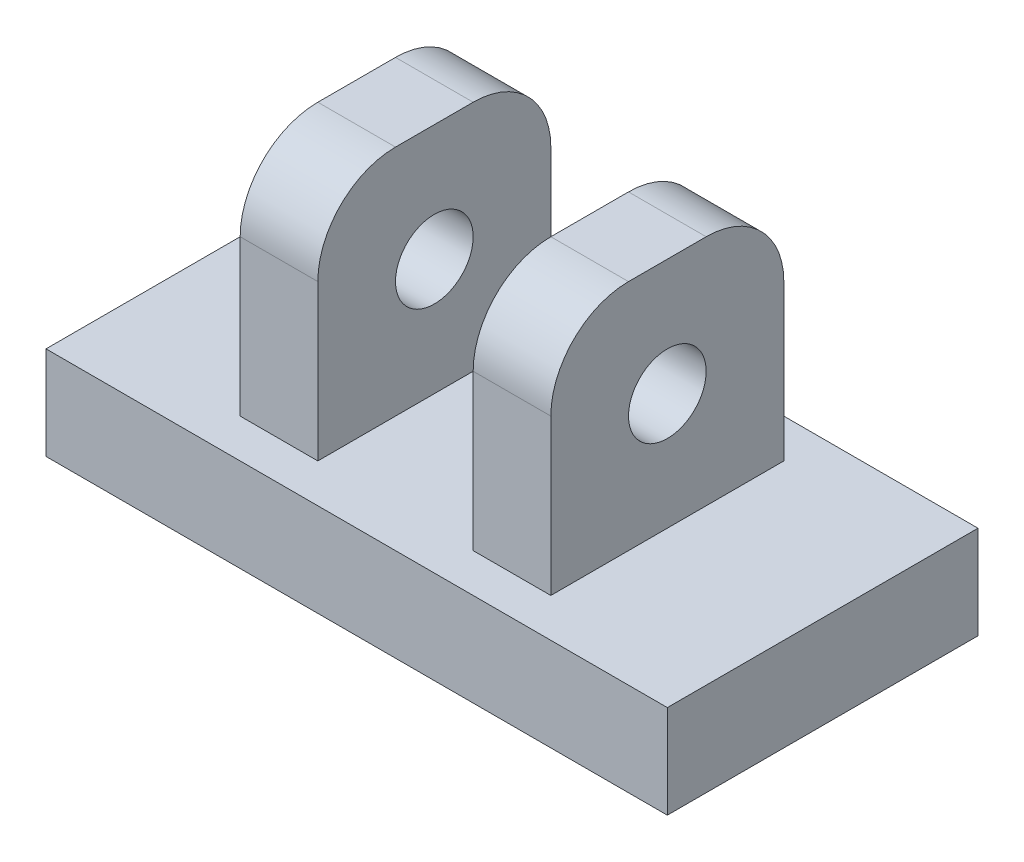
ISO-10303-21;
HEADER;
FILE_DESCRIPTION(('STEP AP214'),'2;1');
FILE_NAME('part.step','',(''),(''),'','','');
FILE_SCHEMA(('AUTOMOTIVE_DESIGN { 1 0 10303 214 1 1 1 1 }'));
ENDSEC;
DATA;
#1=APPLICATION_CONTEXT('core data for automotive mechanical design processes');
#2=APPLICATION_PROTOCOL_DEFINITION('international standard','automotive_design',2000,#1);
#3=PRODUCT_CONTEXT('',#1,'mechanical');
#4=PRODUCT('Part','Part','',(#3));
#5=PRODUCT_RELATED_PRODUCT_CATEGORY('part','',(#4));
#6=PRODUCT_DEFINITION_FORMATION('','',#4);
#7=PRODUCT_DEFINITION_CONTEXT('part definition',#1,'design');
#8=PRODUCT_DEFINITION('design','',#6,#7);
#9=PRODUCT_DEFINITION_SHAPE('','',#8);
#10=(LENGTH_UNIT() NAMED_UNIT(*) SI_UNIT(.MILLI.,.METRE.));
#11=(NAMED_UNIT(*) PLANE_ANGLE_UNIT() SI_UNIT($,.RADIAN.));
#12=(NAMED_UNIT(*) SI_UNIT($,.STERADIAN.) SOLID_ANGLE_UNIT());
#13=UNCERTAINTY_MEASURE_WITH_UNIT(LENGTH_MEASURE(1.E-05),#10,'distance_accuracy_value','');
#14=(GEOMETRIC_REPRESENTATION_CONTEXT(3) GLOBAL_UNCERTAINTY_ASSIGNED_CONTEXT((#13)) GLOBAL_UNIT_ASSIGNED_CONTEXT((#10,
#11,#12)) REPRESENTATION_CONTEXT('',''));
#15=CARTESIAN_POINT('',(0.,0.,0.));
#16=DIRECTION('',(0.,0.,1.));
#17=DIRECTION('',(1.,0.,0.));
#18=AXIS2_PLACEMENT_3D('',#15,#16,#17);
#19=CARTESIAN_POINT('',(0.,6.,-10.));
#20=DIRECTION('',(0.,-1.,0.));
#21=DIRECTION('',(0.,0.,-1.));
#22=AXIS2_PLACEMENT_3D('',#19,#20,#21);
#23=PLANE('',#22);
#24=DIRECTION('',(0.,0.,-1.));
#25=VECTOR('',#24,1.);
#26=CARTESIAN_POINT('',(30.,6.,7.5));
#27=LINE('',#26,#25);
#28=CARTESIAN_POINT('',(30.,6.,7.5));
#29=VERTEX_POINT('',#28);
#30=CARTESIAN_POINT('',(30.,6.,-7.5));
#31=VERTEX_POINT('',#30);
#32=EDGE_CURVE('E189',#29,#31,#27,.T.);
#33=ORIENTED_EDGE('',*,*,#32,.F.);
#34=DIRECTION('',(1.,0.,0.));
#35=VECTOR('',#34,1.);
#36=CARTESIAN_POINT('',(0.,6.,7.5));
#37=LINE('',#36,#35);
#38=CARTESIAN_POINT('',(25.,6.,7.5));
#39=VERTEX_POINT('',#38);
#40=EDGE_CURVE('E156',#39,#29,#37,.T.);
#41=ORIENTED_EDGE('',*,*,#40,.F.);
#42=DIRECTION('',(0.,0.,-1.));
#43=VECTOR('',#42,1.);
#44=CARTESIAN_POINT('',(25.,6.,7.5));
#45=LINE('',#44,#43);
#46=CARTESIAN_POINT('',(25.,6.,-7.5));
#47=VERTEX_POINT('',#46);
#48=EDGE_CURVE('E149',#39,#47,#45,.T.);
#49=ORIENTED_EDGE('',*,*,#48,.T.);
#50=DIRECTION('',(1.,0.,0.));
#51=VECTOR('',#50,1.);
#52=CARTESIAN_POINT('',(0.,6.,-7.5));
#53=LINE('',#52,#51);
#54=EDGE_CURVE('E153',#47,#31,#53,.T.);
#55=ORIENTED_EDGE('',*,*,#54,.T.);
#56=EDGE_LOOP('',(#33,#41,#49,#55));
#57=FACE_BOUND('',#56,.T.);
#58=DIRECTION('',(0.,0.,1.));
#59=VECTOR('',#58,1.);
#60=CARTESIAN_POINT('',(0.,6.,-10.));
#61=LINE('',#60,#59);
#62=CARTESIAN_POINT('',(0.,6.,-10.));
#63=VERTEX_POINT('',#62);
#64=CARTESIAN_POINT('',(0.,6.,10.));
#65=VERTEX_POINT('',#64);
#66=EDGE_CURVE('E247',#63,#65,#61,.T.);
#67=ORIENTED_EDGE('',*,*,#66,.T.);
#68=DIRECTION('',(1.,0.,0.));
#69=VECTOR('',#68,1.);
#70=CARTESIAN_POINT('',(0.,6.,10.));
#71=LINE('',#70,#69);
#72=CARTESIAN_POINT('',(40.,6.,10.));
#73=VERTEX_POINT('',#72);
#74=EDGE_CURVE('E227',#65,#73,#71,.T.);
#75=ORIENTED_EDGE('',*,*,#74,.T.);
#76=DIRECTION('',(0.,0.,1.));
#77=VECTOR('',#76,1.);
#78=CARTESIAN_POINT('',(40.,6.,-10.));
#79=LINE('',#78,#77);
#80=CARTESIAN_POINT('',(40.,6.,-10.));
#81=VERTEX_POINT('',#80);
#82=EDGE_CURVE('E249',#81,#73,#79,.T.);
#83=ORIENTED_EDGE('',*,*,#82,.F.);
#84=DIRECTION('',(1.,0.,0.));
#85=VECTOR('',#84,1.);
#86=CARTESIAN_POINT('',(0.,6.,-10.));
#87=LINE('',#86,#85);
#88=EDGE_CURVE('E239',#63,#81,#87,.T.);
#89=ORIENTED_EDGE('',*,*,#88,.F.);
#90=EDGE_LOOP('',(#67,#75,#83,#89));
#91=FACE_BOUND('',#90,.T.);
#92=DIRECTION('',(1.,0.,0.));
#93=VECTOR('',#92,1.);
#94=CARTESIAN_POINT('',(0.,6.,-7.5));
#95=LINE('',#94,#93);
#96=CARTESIAN_POINT('',(10.,6.,-7.5));
#97=VERTEX_POINT('',#96);
#98=CARTESIAN_POINT('',(15.,6.,-7.5));
#99=VERTEX_POINT('',#98);
#100=EDGE_CURVE('E200',#97,#99,#95,.T.);
#101=ORIENTED_EDGE('',*,*,#100,.T.);
#102=DIRECTION('',(0.,0.,1.));
#103=VECTOR('',#102,1.);
#104=CARTESIAN_POINT('',(15.,6.,-7.5));
#105=LINE('',#104,#103);
#106=CARTESIAN_POINT('',(15.,6.,7.5));
#107=VERTEX_POINT('',#106);
#108=EDGE_CURVE('E209',#99,#107,#105,.T.);
#109=ORIENTED_EDGE('',*,*,#108,.T.);
#110=DIRECTION('',(1.,0.,0.));
#111=VECTOR('',#110,1.);
#112=CARTESIAN_POINT('',(0.,6.,7.5));
#113=LINE('',#112,#111);
#114=CARTESIAN_POINT('',(10.,6.,7.5));
#115=VERTEX_POINT('',#114);
#116=EDGE_CURVE('E191',#115,#107,#113,.T.);
#117=ORIENTED_EDGE('',*,*,#116,.F.);
#118=DIRECTION('',(0.,0.,1.));
#119=VECTOR('',#118,1.);
#120=CARTESIAN_POINT('',(10.,6.,-7.5));
#121=LINE('',#120,#119);
#122=EDGE_CURVE('E210',#97,#115,#121,.T.);
#123=ORIENTED_EDGE('',*,*,#122,.F.);
#124=EDGE_LOOP('',(#101,#109,#117,#123));
#125=FACE_BOUND('',#124,.T.);
#126=ADVANCED_FACE('F35',(#57,#91,#125),#23,.F.);
#127=CARTESIAN_POINT('',(0.,0.,-10.));
#128=DIRECTION('',(0.,-1.,0.));
#129=DIRECTION('',(0.,0.,-1.));
#130=AXIS2_PLACEMENT_3D('',#127,#128,#129);
#131=PLANE('',#130);
#132=DIRECTION('',(0.,0.,1.));
#133=VECTOR('',#132,1.);
#134=CARTESIAN_POINT('',(40.,0.,-10.));
#135=LINE('',#134,#133);
#136=CARTESIAN_POINT('',(40.,0.,-10.));
#137=VERTEX_POINT('',#136);
#138=CARTESIAN_POINT('',(40.,0.,10.));
#139=VERTEX_POINT('',#138);
#140=EDGE_CURVE('E243',#137,#139,#135,.T.);
#141=ORIENTED_EDGE('',*,*,#140,.T.);
#142=DIRECTION('',(1.,0.,0.));
#143=VECTOR('',#142,1.);
#144=CARTESIAN_POINT('',(0.,0.,10.));
#145=LINE('',#144,#143);
#146=CARTESIAN_POINT('',(0.,0.,10.));
#147=VERTEX_POINT('',#146);
#148=EDGE_CURVE('E213',#147,#139,#145,.T.);
#149=ORIENTED_EDGE('',*,*,#148,.F.);
#150=DIRECTION('',(0.,0.,1.));
#151=VECTOR('',#150,1.);
#152=CARTESIAN_POINT('',(0.,0.,-10.));
#153=LINE('',#152,#151);
#154=CARTESIAN_POINT('',(0.,0.,-10.));
#155=VERTEX_POINT('',#154);
#156=EDGE_CURVE('E244',#155,#147,#153,.T.);
#157=ORIENTED_EDGE('',*,*,#156,.F.);
#158=DIRECTION('',(1.,0.,0.));
#159=VECTOR('',#158,1.);
#160=CARTESIAN_POINT('',(0.,0.,-10.));
#161=LINE('',#160,#159);
#162=EDGE_CURVE('E233',#155,#137,#161,.T.);
#163=ORIENTED_EDGE('',*,*,#162,.T.);
#164=EDGE_LOOP('',(#141,#149,#157,#163));
#165=FACE_BOUND('',#164,.T.);
#166=ADVANCED_FACE('F304',(#165),#131,.T.);
#167=CARTESIAN_POINT('',(0.,0.,-10.));
#168=DIRECTION('',(1.,0.,0.));
#169=DIRECTION('',(0.,0.,-1.));
#170=AXIS2_PLACEMENT_3D('',#167,#168,#169);
#171=PLANE('',#170);
#172=ORIENTED_EDGE('',*,*,#156,.T.);
#173=DIRECTION('',(0.,1.,0.));
#174=VECTOR('',#173,1.);
#175=CARTESIAN_POINT('',(0.,0.,10.));
#176=LINE('',#175,#174);
#177=EDGE_CURVE('E230',#147,#65,#176,.T.);
#178=ORIENTED_EDGE('',*,*,#177,.T.);
#179=ORIENTED_EDGE('',*,*,#66,.F.);
#180=DIRECTION('',(0.,1.,0.));
#181=VECTOR('',#180,1.);
#182=CARTESIAN_POINT('',(0.,0.,-10.));
#183=LINE('',#182,#181);
#184=EDGE_CURVE('E241',#155,#63,#183,.T.);
#185=ORIENTED_EDGE('',*,*,#184,.F.);
#186=EDGE_LOOP('',(#172,#178,#179,#185));
#187=FACE_BOUND('',#186,.T.);
#188=ADVANCED_FACE('F309',(#187),#171,.F.);
#189=CARTESIAN_POINT('',(40.,0.,-10.));
#190=DIRECTION('',(1.,0.,0.));
#191=DIRECTION('',(0.,0.,-1.));
#192=AXIS2_PLACEMENT_3D('',#189,#190,#191);
#193=PLANE('',#192);
#194=ORIENTED_EDGE('',*,*,#82,.T.);
#195=DIRECTION('',(0.,1.,0.));
#196=VECTOR('',#195,1.);
#197=CARTESIAN_POINT('',(40.,0.,10.));
#198=LINE('',#197,#196);
#199=EDGE_CURVE('E224',#139,#73,#198,.T.);
#200=ORIENTED_EDGE('',*,*,#199,.F.);
#201=ORIENTED_EDGE('',*,*,#140,.F.);
#202=DIRECTION('',(0.,1.,0.));
#203=VECTOR('',#202,1.);
#204=CARTESIAN_POINT('',(40.,0.,-10.));
#205=LINE('',#204,#203);
#206=EDGE_CURVE('E236',#137,#81,#205,.T.);
#207=ORIENTED_EDGE('',*,*,#206,.T.);
#208=EDGE_LOOP('',(#194,#200,#201,#207));
#209=FACE_BOUND('',#208,.T.);
#210=ADVANCED_FACE('F315',(#209),#193,.T.);
#211=CARTESIAN_POINT('',(0.,0.,-10.));
#212=DIRECTION('',(0.,0.,1.));
#213=DIRECTION('',(1.,0.,0.));
#214=AXIS2_PLACEMENT_3D('',#211,#212,#213);
#215=PLANE('',#214);
#216=ORIENTED_EDGE('',*,*,#162,.F.);
#217=ORIENTED_EDGE('',*,*,#184,.T.);
#218=ORIENTED_EDGE('',*,*,#88,.T.);
#219=ORIENTED_EDGE('',*,*,#206,.F.);
#220=EDGE_LOOP('',(#216,#217,#218,#219));
#221=FACE_BOUND('',#220,.T.);
#222=ADVANCED_FACE('F317',(#221),#215,.F.);
#223=CARTESIAN_POINT('',(0.,0.,10.));
#224=DIRECTION('',(0.,0.,1.));
#225=DIRECTION('',(1.,0.,0.));
#226=AXIS2_PLACEMENT_3D('',#223,#224,#225);
#227=PLANE('',#226);
#228=ORIENTED_EDGE('',*,*,#148,.T.);
#229=ORIENTED_EDGE('',*,*,#199,.T.);
#230=ORIENTED_EDGE('',*,*,#74,.F.);
#231=ORIENTED_EDGE('',*,*,#177,.F.);
#232=EDGE_LOOP('',(#228,#229,#230,#231));
#233=FACE_BOUND('',#232,.T.);
#234=ADVANCED_FACE('F370',(#233),#227,.T.);
#235=CARTESIAN_POINT('',(10.,0.,-7.5));
#236=DIRECTION('',(1.,0.,0.));
#237=DIRECTION('',(0.,1.,0.));
#238=AXIS2_PLACEMENT_3D('',#235,#236,#237);
#239=PLANE('',#238);
#240=CARTESIAN_POINT('',(10.,13.5,0.));
#241=DIRECTION('',(-1.,0.,0.));
#242=DIRECTION('',(0.,0.,1.));
#243=AXIS2_PLACEMENT_3D('',#240,#241,#242);
#244=CIRCLE('',#243,2.5);
#245=CARTESIAN_POINT('',(10.,13.5,2.5));
#246=VERTEX_POINT('',#245);
#247=EDGE_CURVE('E255',#246,#246,#244,.T.);
#248=ORIENTED_EDGE('',*,*,#247,.F.);
#249=EDGE_LOOP('',(#248));
#250=FACE_BOUND('',#249,.T.);
#251=DIRECTION('',(0.,0.,1.));
#252=VECTOR('',#251,1.);
#253=CARTESIAN_POINT('',(10.,21.,-7.5));
#254=LINE('',#253,#252);
#255=CARTESIAN_POINT('',(10.,21.,-2.5));
#256=VERTEX_POINT('',#255);
#257=CARTESIAN_POINT('',(10.,21.,2.5));
#258=VERTEX_POINT('',#257);
#259=EDGE_CURVE('E214',#256,#258,#254,.T.);
#260=ORIENTED_EDGE('',*,*,#259,.F.);
#261=CARTESIAN_POINT('',(10.,16.,-2.5));
#262=DIRECTION('',(1.,0.,0.));
#263=DIRECTION('',(0.,1.,0.));
#264=AXIS2_PLACEMENT_3D('',#261,#262,#263);
#265=CIRCLE('',#264,5.);
#266=CARTESIAN_POINT('',(10.,16.,-7.5));
#267=VERTEX_POINT('',#266);
#268=EDGE_CURVE('E269',#256,#267,#265,.F.);
#269=ORIENTED_EDGE('',*,*,#268,.T.);
#270=DIRECTION('',(0.,1.,0.));
#271=VECTOR('',#270,1.);
#272=CARTESIAN_POINT('',(10.,0.,-7.5));
#273=LINE('',#272,#271);
#274=EDGE_CURVE('E206',#97,#267,#273,.T.);
#275=ORIENTED_EDGE('',*,*,#274,.F.);
#276=ORIENTED_EDGE('',*,*,#122,.T.);
#277=DIRECTION('',(0.,1.,0.));
#278=VECTOR('',#277,1.);
#279=CARTESIAN_POINT('',(10.,0.,7.5));
#280=LINE('',#279,#278);
#281=CARTESIAN_POINT('',(10.,16.,7.5));
#282=VERTEX_POINT('',#281);
#283=EDGE_CURVE('E197',#115,#282,#280,.T.);
#284=ORIENTED_EDGE('',*,*,#283,.T.);
#285=CARTESIAN_POINT('',(10.,16.,2.5));
#286=DIRECTION('',(1.,0.,0.));
#287=DIRECTION('',(0.,1.,0.));
#288=AXIS2_PLACEMENT_3D('',#285,#286,#287);
#289=CIRCLE('',#288,5.);
#290=EDGE_CURVE('E267',#282,#258,#289,.F.);
#291=ORIENTED_EDGE('',*,*,#290,.T.);
#292=EDGE_LOOP('',(#260,#269,#275,#276,#284,#291));
#293=FACE_BOUND('',#292,.T.);
#294=ADVANCED_FACE('F340',(#250,#293),#239,.F.);
#295=CARTESIAN_POINT('',(0.,21.,-7.5));
#296=DIRECTION('',(0.,-1.,0.));
#297=DIRECTION('',(0.,0.,-1.));
#298=AXIS2_PLACEMENT_3D('',#295,#296,#297);
#299=PLANE('',#298);
#300=DIRECTION('',(0.,0.,1.));
#301=VECTOR('',#300,1.);
#302=CARTESIAN_POINT('',(15.,21.,-7.5));
#303=LINE('',#302,#301);
#304=CARTESIAN_POINT('',(15.,21.,-2.5));
#305=VERTEX_POINT('',#304);
#306=CARTESIAN_POINT('',(15.,21.,2.5));
#307=VERTEX_POINT('',#306);
#308=EDGE_CURVE('E217',#305,#307,#303,.T.);
#309=ORIENTED_EDGE('',*,*,#308,.F.);
#310=DIRECTION('',(1.,0.,0.));
#311=VECTOR('',#310,1.);
#312=CARTESIAN_POINT('',(0.,21.,-2.5));
#313=LINE('',#312,#311);
#314=EDGE_CURVE('E265',#305,#256,#313,.F.);
#315=ORIENTED_EDGE('',*,*,#314,.T.);
#316=ORIENTED_EDGE('',*,*,#259,.T.);
#317=DIRECTION('',(1.,0.,0.));
#318=VECTOR('',#317,1.);
#319=CARTESIAN_POINT('',(15.,21.,2.5));
#320=LINE('',#319,#318);
#321=EDGE_CURVE('E262',#258,#307,#320,.T.);
#322=ORIENTED_EDGE('',*,*,#321,.T.);
#323=EDGE_LOOP('',(#309,#315,#316,#322));
#324=FACE_BOUND('',#323,.T.);
#325=ADVANCED_FACE('F344',(#324),#299,.F.);
#326=CARTESIAN_POINT('',(15.,0.,-7.5));
#327=DIRECTION('',(1.,0.,0.));
#328=DIRECTION('',(0.,1.,0.));
#329=AXIS2_PLACEMENT_3D('',#326,#327,#328);
#330=PLANE('',#329);
#331=CARTESIAN_POINT('',(15.,13.5,0.));
#332=DIRECTION('',(1.,0.,0.));
#333=DIRECTION('',(0.,1.,0.));
#334=AXIS2_PLACEMENT_3D('',#331,#332,#333);
#335=CIRCLE('',#334,2.5);
#336=CARTESIAN_POINT('',(15.,16.,0.));
#337=VERTEX_POINT('',#336);
#338=EDGE_CURVE('E174',#337,#337,#335,.T.);
#339=ORIENTED_EDGE('',*,*,#338,.F.);
#340=EDGE_LOOP('',(#339));
#341=FACE_BOUND('',#340,.T.);
#342=DIRECTION('',(0.,1.,0.));
#343=VECTOR('',#342,1.);
#344=CARTESIAN_POINT('',(15.,0.,-7.5));
#345=LINE('',#344,#343);
#346=CARTESIAN_POINT('',(15.,16.,-7.5));
#347=VERTEX_POINT('',#346);
#348=EDGE_CURVE('E203',#99,#347,#345,.T.);
#349=ORIENTED_EDGE('',*,*,#348,.T.);
#350=CARTESIAN_POINT('',(15.,16.,-2.5));
#351=DIRECTION('',(1.,0.,0.));
#352=DIRECTION('',(0.,1.,0.));
#353=AXIS2_PLACEMENT_3D('',#350,#351,#352);
#354=CIRCLE('',#353,5.);
#355=EDGE_CURVE('E260',#347,#305,#354,.T.);
#356=ORIENTED_EDGE('',*,*,#355,.T.);
#357=ORIENTED_EDGE('',*,*,#308,.T.);
#358=CARTESIAN_POINT('',(15.,16.,2.5));
#359=DIRECTION('',(1.,0.,0.));
#360=DIRECTION('',(0.,1.,0.));
#361=AXIS2_PLACEMENT_3D('',#358,#359,#360);
#362=CIRCLE('',#361,5.);
#363=CARTESIAN_POINT('',(15.,16.,7.5));
#364=VERTEX_POINT('',#363);
#365=EDGE_CURVE('E258',#307,#364,#362,.T.);
#366=ORIENTED_EDGE('',*,*,#365,.T.);
#367=DIRECTION('',(0.,1.,0.));
#368=VECTOR('',#367,1.);
#369=CARTESIAN_POINT('',(15.,0.,7.5));
#370=LINE('',#369,#368);
#371=EDGE_CURVE('E194',#107,#364,#370,.T.);
#372=ORIENTED_EDGE('',*,*,#371,.F.);
#373=ORIENTED_EDGE('',*,*,#108,.F.);
#374=EDGE_LOOP('',(#349,#356,#357,#366,#372,#373));
#375=FACE_BOUND('',#374,.T.);
#376=ADVANCED_FACE('F357',(#341,#375),#330,.T.);
#377=CARTESIAN_POINT('',(0.,0.,-7.5));
#378=DIRECTION('',(0.,0.,1.));
#379=DIRECTION('',(1.,0.,0.));
#380=AXIS2_PLACEMENT_3D('',#377,#378,#379);
#381=PLANE('',#380);
#382=ORIENTED_EDGE('',*,*,#274,.T.);
#383=DIRECTION('',(1.,0.,0.));
#384=VECTOR('',#383,1.);
#385=CARTESIAN_POINT('',(0.,16.,-7.5));
#386=LINE('',#385,#384);
#387=EDGE_CURVE('E246',#267,#347,#386,.T.);
#388=ORIENTED_EDGE('',*,*,#387,.T.);
#389=ORIENTED_EDGE('',*,*,#348,.F.);
#390=ORIENTED_EDGE('',*,*,#100,.F.);
#391=EDGE_LOOP('',(#382,#388,#389,#390));
#392=FACE_BOUND('',#391,.T.);
#393=ADVANCED_FACE('F349',(#392),#381,.F.);
#394=CARTESIAN_POINT('',(0.,0.,7.5));
#395=DIRECTION('',(0.,0.,1.));
#396=DIRECTION('',(1.,0.,0.));
#397=AXIS2_PLACEMENT_3D('',#394,#395,#396);
#398=PLANE('',#397);
#399=ORIENTED_EDGE('',*,*,#371,.T.);
#400=DIRECTION('',(1.,0.,0.));
#401=VECTOR('',#400,1.);
#402=CARTESIAN_POINT('',(10.,16.,7.5));
#403=LINE('',#402,#401);
#404=EDGE_CURVE('E11',#364,#282,#403,.F.);
#405=ORIENTED_EDGE('',*,*,#404,.T.);
#406=ORIENTED_EDGE('',*,*,#283,.F.);
#407=ORIENTED_EDGE('',*,*,#116,.T.);
#408=EDGE_LOOP('',(#399,#405,#406,#407));
#409=FACE_BOUND('',#408,.T.);
#410=ADVANCED_FACE('F355',(#409),#398,.T.);
#411=CARTESIAN_POINT('',(30.,0.,7.5));
#412=DIRECTION('',(-1.,0.,0.));
#413=DIRECTION('',(0.,0.,1.));
#414=AXIS2_PLACEMENT_3D('',#411,#412,#413);
#415=PLANE('',#414);
#416=CARTESIAN_POINT('',(30.,13.5,0.));
#417=DIRECTION('',(-1.,0.,0.));
#418=DIRECTION('',(0.,0.,1.));
#419=AXIS2_PLACEMENT_3D('',#416,#417,#418);
#420=CIRCLE('',#419,2.5);
#421=CARTESIAN_POINT('',(30.,13.5,2.5));
#422=VERTEX_POINT('',#421);
#423=EDGE_CURVE('E178',#422,#422,#420,.T.);
#424=ORIENTED_EDGE('',*,*,#423,.T.);
#425=EDGE_LOOP('',(#424));
#426=FACE_BOUND('',#425,.T.);
#427=DIRECTION('',(0.,1.,0.));
#428=VECTOR('',#427,1.);
#429=CARTESIAN_POINT('',(30.,0.,-7.5));
#430=LINE('',#429,#428);
#431=CARTESIAN_POINT('',(30.,16.,-7.5));
#432=VERTEX_POINT('',#431);
#433=EDGE_CURVE('E169',#31,#432,#430,.T.);
#434=ORIENTED_EDGE('',*,*,#433,.T.);
#435=CARTESIAN_POINT('',(30.,16.,-2.5));
#436=DIRECTION('',(-1.,0.,0.));
#437=DIRECTION('',(0.,0.,1.));
#438=AXIS2_PLACEMENT_3D('',#435,#436,#437);
#439=CIRCLE('',#438,5.);
#440=CARTESIAN_POINT('',(30.,21.,-2.5));
#441=VERTEX_POINT('',#440);
#442=EDGE_CURVE('E275',#432,#441,#439,.F.);
#443=ORIENTED_EDGE('',*,*,#442,.T.);
#444=DIRECTION('',(0.,0.,-1.));
#445=VECTOR('',#444,1.);
#446=CARTESIAN_POINT('',(30.,21.,7.5));
#447=LINE('',#446,#445);
#448=CARTESIAN_POINT('',(30.,21.,2.5));
#449=VERTEX_POINT('',#448);
#450=EDGE_CURVE('E187',#449,#441,#447,.T.);
#451=ORIENTED_EDGE('',*,*,#450,.F.);
#452=CARTESIAN_POINT('',(30.,16.,2.5));
#453=DIRECTION('',(-1.,0.,0.));
#454=DIRECTION('',(0.,0.,1.));
#455=AXIS2_PLACEMENT_3D('',#452,#453,#454);
#456=CIRCLE('',#455,5.);
#457=CARTESIAN_POINT('',(30.,16.,7.5));
#458=VERTEX_POINT('',#457);
#459=EDGE_CURVE('E273',#449,#458,#456,.F.);
#460=ORIENTED_EDGE('',*,*,#459,.T.);
#461=DIRECTION('',(0.,1.,0.));
#462=VECTOR('',#461,1.);
#463=CARTESIAN_POINT('',(30.,0.,7.5));
#464=LINE('',#463,#462);
#465=EDGE_CURVE('E183',#29,#458,#464,.T.);
#466=ORIENTED_EDGE('',*,*,#465,.F.);
#467=ORIENTED_EDGE('',*,*,#32,.T.);
#468=EDGE_LOOP('',(#434,#443,#451,#460,#466,#467));
#469=FACE_BOUND('',#468,.T.);
#470=ADVANCED_FACE('F291',(#426,#469),#415,.F.);
#471=CARTESIAN_POINT('',(0.,21.,7.5));
#472=DIRECTION('',(0.,1.,0.));
#473=DIRECTION('',(0.,0.,1.));
#474=AXIS2_PLACEMENT_3D('',#471,#472,#473);
#475=PLANE('',#474);
#476=ORIENTED_EDGE('',*,*,#450,.T.);
#477=DIRECTION('',(1.,0.,0.));
#478=VECTOR('',#477,1.);
#479=CARTESIAN_POINT('',(25.,21.,-2.5));
#480=LINE('',#479,#478);
#481=CARTESIAN_POINT('',(25.,21.,-2.5));
#482=VERTEX_POINT('',#481);
#483=EDGE_CURVE('E57',#441,#482,#480,.F.);
#484=ORIENTED_EDGE('',*,*,#483,.T.);
#485=DIRECTION('',(0.,0.,-1.));
#486=VECTOR('',#485,1.);
#487=CARTESIAN_POINT('',(25.,21.,7.5));
#488=LINE('',#487,#486);
#489=CARTESIAN_POINT('',(25.,21.,2.5));
#490=VERTEX_POINT('',#489);
#491=EDGE_CURVE('E158',#490,#482,#488,.T.);
#492=ORIENTED_EDGE('',*,*,#491,.F.);
#493=DIRECTION('',(1.,0.,0.));
#494=VECTOR('',#493,1.);
#495=CARTESIAN_POINT('',(0.,21.,2.5));
#496=LINE('',#495,#494);
#497=EDGE_CURVE('E277',#490,#449,#496,.T.);
#498=ORIENTED_EDGE('',*,*,#497,.T.);
#499=EDGE_LOOP('',(#476,#484,#492,#498));
#500=FACE_BOUND('',#499,.T.);
#501=ADVANCED_FACE('F286',(#500),#475,.T.);
#502=CARTESIAN_POINT('',(25.,0.,7.5));
#503=DIRECTION('',(-1.,0.,0.));
#504=DIRECTION('',(0.,0.,1.));
#505=AXIS2_PLACEMENT_3D('',#502,#503,#504);
#506=PLANE('',#505);
#507=CARTESIAN_POINT('',(25.,13.5,0.));
#508=DIRECTION('',(-1.,0.,0.));
#509=DIRECTION('',(0.,0.,1.));
#510=AXIS2_PLACEMENT_3D('',#507,#508,#509);
#511=CIRCLE('',#510,2.5);
#512=CARTESIAN_POINT('',(25.,13.5,2.5));
#513=VERTEX_POINT('',#512);
#514=EDGE_CURVE('E252',#513,#513,#511,.T.);
#515=ORIENTED_EDGE('',*,*,#514,.F.);
#516=EDGE_LOOP('',(#515));
#517=FACE_BOUND('',#516,.T.);
#518=ORIENTED_EDGE('',*,*,#491,.T.);
#519=CARTESIAN_POINT('',(25.,16.,-2.5));
#520=DIRECTION('',(-1.,0.,0.));
#521=DIRECTION('',(0.,0.,1.));
#522=AXIS2_PLACEMENT_3D('',#519,#520,#521);
#523=CIRCLE('',#522,5.);
#524=CARTESIAN_POINT('',(25.,16.,-7.5));
#525=VERTEX_POINT('',#524);
#526=EDGE_CURVE('E165',#482,#525,#523,.T.);
#527=ORIENTED_EDGE('',*,*,#526,.T.);
#528=DIRECTION('',(0.,1.,0.));
#529=VECTOR('',#528,1.);
#530=CARTESIAN_POINT('',(25.,0.,-7.5));
#531=LINE('',#530,#529);
#532=EDGE_CURVE('E162',#47,#525,#531,.T.);
#533=ORIENTED_EDGE('',*,*,#532,.F.);
#534=ORIENTED_EDGE('',*,*,#48,.F.);
#535=DIRECTION('',(0.,1.,0.));
#536=VECTOR('',#535,1.);
#537=CARTESIAN_POINT('',(25.,0.,7.5));
#538=LINE('',#537,#536);
#539=CARTESIAN_POINT('',(25.,16.,7.5));
#540=VERTEX_POINT('',#539);
#541=EDGE_CURVE('E159',#39,#540,#538,.T.);
#542=ORIENTED_EDGE('',*,*,#541,.T.);
#543=CARTESIAN_POINT('',(25.,16.,2.5));
#544=DIRECTION('',(-1.,0.,0.));
#545=DIRECTION('',(0.,0.,1.));
#546=AXIS2_PLACEMENT_3D('',#543,#544,#545);
#547=CIRCLE('',#546,5.);
#548=EDGE_CURVE('E281',#540,#490,#547,.T.);
#549=ORIENTED_EDGE('',*,*,#548,.T.);
#550=EDGE_LOOP('',(#518,#527,#533,#534,#542,#549));
#551=FACE_BOUND('',#550,.T.);
#552=ADVANCED_FACE('F163',(#517,#551),#506,.T.);
#553=CARTESIAN_POINT('',(0.,0.,7.5));
#554=DIRECTION('',(0.,0.,1.));
#555=DIRECTION('',(1.,0.,0.));
#556=AXIS2_PLACEMENT_3D('',#553,#554,#555);
#557=PLANE('',#556);
#558=ORIENTED_EDGE('',*,*,#465,.T.);
#559=DIRECTION('',(1.,0.,0.));
#560=VECTOR('',#559,1.);
#561=CARTESIAN_POINT('',(0.,16.,7.5));
#562=LINE('',#561,#560);
#563=EDGE_CURVE('E43',#458,#540,#562,.F.);
#564=ORIENTED_EDGE('',*,*,#563,.T.);
#565=ORIENTED_EDGE('',*,*,#541,.F.);
#566=ORIENTED_EDGE('',*,*,#40,.T.);
#567=EDGE_LOOP('',(#558,#564,#565,#566));
#568=FACE_BOUND('',#567,.T.);
#569=ADVANCED_FACE('F292',(#568),#557,.T.);
#570=CARTESIAN_POINT('',(0.,0.,-7.5));
#571=DIRECTION('',(0.,0.,1.));
#572=DIRECTION('',(1.,0.,0.));
#573=AXIS2_PLACEMENT_3D('',#570,#571,#572);
#574=PLANE('',#573);
#575=ORIENTED_EDGE('',*,*,#532,.T.);
#576=DIRECTION('',(1.,0.,0.));
#577=VECTOR('',#576,1.);
#578=CARTESIAN_POINT('',(30.,16.,-7.5));
#579=LINE('',#578,#577);
#580=EDGE_CURVE('E271',#525,#432,#579,.T.);
#581=ORIENTED_EDGE('',*,*,#580,.T.);
#582=ORIENTED_EDGE('',*,*,#433,.F.);
#583=ORIENTED_EDGE('',*,*,#54,.F.);
#584=EDGE_LOOP('',(#575,#581,#582,#583));
#585=FACE_BOUND('',#584,.T.);
#586=ADVANCED_FACE('F172',(#585),#574,.F.);
#587=CARTESIAN_POINT('',(40.,13.5,0.));
#588=DIRECTION('',(-1.,0.,0.));
#589=DIRECTION('',(0.,0.,1.));
#590=AXIS2_PLACEMENT_3D('',#587,#588,#589);
#591=CYLINDRICAL_SURFACE('',#590,2.5);
#592=ORIENTED_EDGE('',*,*,#514,.T.);
#593=EDGE_LOOP('',(#592));
#594=FACE_BOUND('',#593,.T.);
#595=ORIENTED_EDGE('',*,*,#423,.F.);
#596=EDGE_LOOP('',(#595));
#597=FACE_BOUND('',#596,.T.);
#598=ADVANCED_FACE('F299',(#594,#597),#591,.F.);
#599=ORIENTED_EDGE('',*,*,#338,.T.);
#600=EDGE_LOOP('',(#599));
#601=FACE_BOUND('',#600,.T.);
#602=ORIENTED_EDGE('',*,*,#247,.T.);
#603=EDGE_LOOP('',(#602));
#604=FACE_BOUND('',#603,.T.);
#605=ADVANCED_FACE('F324',(#601,#604),#591,.F.);
#606=CARTESIAN_POINT('',(0.,16.,-2.5));
#607=DIRECTION('',(1.,0.,0.));
#608=DIRECTION('',(0.,0.,-1.));
#609=AXIS2_PLACEMENT_3D('',#606,#607,#608);
#610=CYLINDRICAL_SURFACE('',#609,5.);
#611=ORIENTED_EDGE('',*,*,#268,.F.);
#612=ORIENTED_EDGE('',*,*,#314,.F.);
#613=ORIENTED_EDGE('',*,*,#355,.F.);
#614=ORIENTED_EDGE('',*,*,#387,.F.);
#615=EDGE_LOOP('',(#611,#612,#613,#614));
#616=FACE_BOUND('',#615,.T.);
#617=ADVANCED_FACE('F320',(#616),#610,.T.);
#618=CARTESIAN_POINT('',(0.,16.,-2.5));
#619=DIRECTION('',(-1.,0.,0.));
#620=DIRECTION('',(0.,0.,1.));
#621=AXIS2_PLACEMENT_3D('',#618,#619,#620);
#622=CYLINDRICAL_SURFACE('',#621,5.);
#623=ORIENTED_EDGE('',*,*,#526,.F.);
#624=ORIENTED_EDGE('',*,*,#483,.F.);
#625=ORIENTED_EDGE('',*,*,#442,.F.);
#626=ORIENTED_EDGE('',*,*,#580,.F.);
#627=EDGE_LOOP('',(#623,#624,#625,#626));
#628=FACE_BOUND('',#627,.T.);
#629=ADVANCED_FACE('F323',(#628),#622,.T.);
#630=CARTESIAN_POINT('',(0.,16.,2.5));
#631=DIRECTION('',(1.,0.,0.));
#632=DIRECTION('',(0.,0.,-1.));
#633=AXIS2_PLACEMENT_3D('',#630,#631,#632);
#634=CYLINDRICAL_SURFACE('',#633,5.);
#635=ORIENTED_EDGE('',*,*,#548,.F.);
#636=ORIENTED_EDGE('',*,*,#563,.F.);
#637=ORIENTED_EDGE('',*,*,#459,.F.);
#638=ORIENTED_EDGE('',*,*,#497,.F.);
#639=EDGE_LOOP('',(#635,#636,#637,#638));
#640=FACE_BOUND('',#639,.T.);
#641=ADVANCED_FACE('F288',(#640),#634,.T.);
#642=CARTESIAN_POINT('',(0.,16.,2.5));
#643=DIRECTION('',(-1.,0.,0.));
#644=DIRECTION('',(0.,0.,1.));
#645=AXIS2_PLACEMENT_3D('',#642,#643,#644);
#646=CYLINDRICAL_SURFACE('',#645,5.);
#647=ORIENTED_EDGE('',*,*,#290,.F.);
#648=ORIENTED_EDGE('',*,*,#404,.F.);
#649=ORIENTED_EDGE('',*,*,#365,.F.);
#650=ORIENTED_EDGE('',*,*,#321,.F.);
#651=EDGE_LOOP('',(#647,#648,#649,#650));
#652=FACE_BOUND('',#651,.T.);
#653=ADVANCED_FACE('F37',(#652),#646,.T.);
#654=CLOSED_SHELL('',(#126,#166,#188,#210,#222,#234,#294,#325,#376,#393,#410,#470,#501,#552,
#569,#586,#598,#605,#617,#629,#641,#653));
#655=MANIFOLD_SOLID_BREP('B2',#654);
#656=ADVANCED_BREP_SHAPE_REPRESENTATION('',(#18,#655),#14);
#657=SHAPE_DEFINITION_REPRESENTATION(#9,#656);
ENDSEC;
END-ISO-10303-21;
